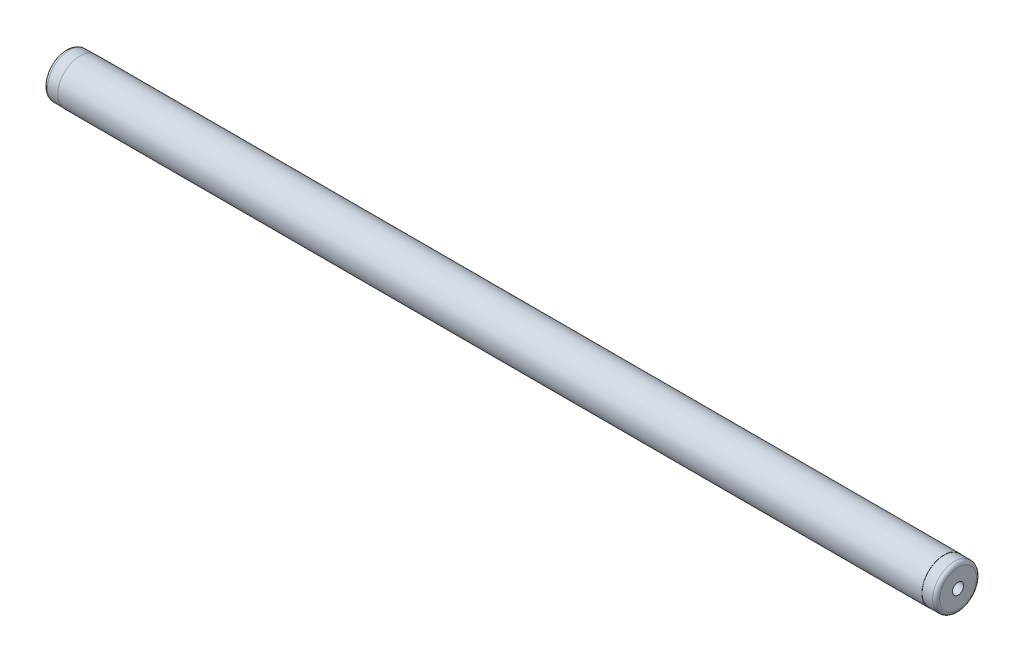
ISO-10303-21;
HEADER;
FILE_DESCRIPTION(('STEP AP214'),'2;1');
FILE_NAME('part.step','',(''),(''),'','','');
FILE_SCHEMA(('AUTOMOTIVE_DESIGN { 1 0 10303 214 1 1 1 1 }'));
ENDSEC;
DATA;
#1=APPLICATION_CONTEXT('core data for automotive mechanical design processes');
#2=APPLICATION_PROTOCOL_DEFINITION('international standard','automotive_design',2000,#1);
#3=PRODUCT_CONTEXT('',#1,'mechanical');
#4=PRODUCT('Part','Part','',(#3));
#5=PRODUCT_RELATED_PRODUCT_CATEGORY('part','',(#4));
#6=PRODUCT_DEFINITION_FORMATION('','',#4);
#7=PRODUCT_DEFINITION_CONTEXT('part definition',#1,'design');
#8=PRODUCT_DEFINITION('design','',#6,#7);
#9=PRODUCT_DEFINITION_SHAPE('','',#8);
#10=(LENGTH_UNIT() NAMED_UNIT(*) SI_UNIT(.MILLI.,.METRE.));
#11=(NAMED_UNIT(*) PLANE_ANGLE_UNIT() SI_UNIT($,.RADIAN.));
#12=(NAMED_UNIT(*) SI_UNIT($,.STERADIAN.) SOLID_ANGLE_UNIT());
#13=UNCERTAINTY_MEASURE_WITH_UNIT(LENGTH_MEASURE(1.E-05),#10,'distance_accuracy_value','');
#14=(GEOMETRIC_REPRESENTATION_CONTEXT(3) GLOBAL_UNCERTAINTY_ASSIGNED_CONTEXT((#13)) GLOBAL_UNIT_ASSIGNED_CONTEXT((#10,
#11,#12)) REPRESENTATION_CONTEXT('',''));
#15=CARTESIAN_POINT('',(0.,0.,0.));
#16=DIRECTION('',(0.,0.,1.));
#17=DIRECTION('',(1.,0.,0.));
#18=AXIS2_PLACEMENT_3D('',#15,#16,#17);
#19=CARTESIAN_POINT('',(60.5,0.4,0.));
#20=DIRECTION('',(1.,0.,0.));
#21=DIRECTION('',(0.,0.,-1.));
#22=AXIS2_PLACEMENT_3D('',#19,#20,#21);
#23=PLANE('',#22);
#24=CARTESIAN_POINT('',(60.5,0.,0.));
#25=DIRECTION('',(1.,0.,0.));
#26=DIRECTION('',(0.,0.,-1.));
#27=AXIS2_PLACEMENT_3D('',#24,#25,#26);
#28=CIRCLE('',#27,0.8);
#29=CARTESIAN_POINT('',(60.5,0.,-0.8));
#30=VERTEX_POINT('',#29);
#31=EDGE_CURVE('E17',#30,#30,#28,.T.);
#32=ORIENTED_EDGE('',*,*,#31,.T.);
#33=EDGE_LOOP('',(#32));
#34=FACE_BOUND('',#33,.T.);
#35=ADVANCED_FACE('F14',(#34),#23,.T.);
#36=CARTESIAN_POINT('',(-60.5,0.4,0.));
#37=DIRECTION('',(-1.,0.,0.));
#38=DIRECTION('',(0.,0.,1.));
#39=AXIS2_PLACEMENT_3D('',#36,#37,#38);
#40=PLANE('',#39);
#41=CARTESIAN_POINT('',(-60.5,0.,0.));
#42=DIRECTION('',(1.,0.,0.));
#43=DIRECTION('',(0.,0.,-1.));
#44=AXIS2_PLACEMENT_3D('',#41,#42,#43);
#45=CIRCLE('',#44,0.8);
#46=CARTESIAN_POINT('',(-60.5,0.,-0.8));
#47=VERTEX_POINT('',#46);
#48=EDGE_CURVE('E46',#47,#47,#45,.F.);
#49=ORIENTED_EDGE('',*,*,#48,.T.);
#50=EDGE_LOOP('',(#49));
#51=FACE_BOUND('',#50,.T.);
#52=ADVANCED_FACE('F57',(#51),#40,.T.);
#53=CARTESIAN_POINT('',(62.,0.,0.));
#54=DIRECTION('',(1.,0.,0.));
#55=DIRECTION('',(0.,0.,-1.));
#56=AXIS2_PLACEMENT_3D('',#53,#54,#55);
#57=CYLINDRICAL_SURFACE('',#56,0.8);
#58=CARTESIAN_POINT('',(63.5,0.,0.));
#59=DIRECTION('',(1.,0.,0.));
#60=DIRECTION('',(0.,0.,-1.));
#61=AXIS2_PLACEMENT_3D('',#58,#59,#60);
#62=CIRCLE('',#61,0.8);
#63=CARTESIAN_POINT('',(63.5,0.,-0.8));
#64=VERTEX_POINT('',#63);
#65=EDGE_CURVE('E44',#64,#64,#62,.F.);
#66=ORIENTED_EDGE('',*,*,#65,.F.);
#67=EDGE_LOOP('',(#66));
#68=FACE_BOUND('',#67,.T.);
#69=ORIENTED_EDGE('',*,*,#31,.F.);
#70=EDGE_LOOP('',(#69));
#71=FACE_BOUND('',#70,.T.);
#72=ADVANCED_FACE('F54',(#68,#71),#57,.F.);
#73=CARTESIAN_POINT('',(-62.,0.,0.));
#74=DIRECTION('',(1.,0.,0.));
#75=DIRECTION('',(0.,0.,-1.));
#76=AXIS2_PLACEMENT_3D('',#73,#74,#75);
#77=CYLINDRICAL_SURFACE('',#76,0.8);
#78=ORIENTED_EDGE('',*,*,#48,.F.);
#79=EDGE_LOOP('',(#78));
#80=FACE_BOUND('',#79,.T.);
#81=CARTESIAN_POINT('',(-63.5,0.,0.));
#82=DIRECTION('',(1.,0.,0.));
#83=DIRECTION('',(0.,0.,-1.));
#84=AXIS2_PLACEMENT_3D('',#81,#82,#83);
#85=CIRCLE('',#84,0.8);
#86=CARTESIAN_POINT('',(-63.5,0.,-0.8));
#87=VERTEX_POINT('',#86);
#88=EDGE_CURVE('E40',#87,#87,#85,.T.);
#89=ORIENTED_EDGE('',*,*,#88,.F.);
#90=EDGE_LOOP('',(#89));
#91=FACE_BOUND('',#90,.T.);
#92=ADVANCED_FACE('F56',(#80,#91),#77,.F.);
#93=CARTESIAN_POINT('',(63.5,1.7125,0.));
#94=DIRECTION('',(1.,0.,0.));
#95=DIRECTION('',(0.,0.,-1.));
#96=AXIS2_PLACEMENT_3D('',#93,#94,#95);
#97=PLANE('',#96);
#98=ORIENTED_EDGE('',*,*,#65,.T.);
#99=EDGE_LOOP('',(#98));
#100=FACE_BOUND('',#99,.T.);
#101=CARTESIAN_POINT('',(63.5,0.,0.));
#102=DIRECTION('',(-1.,0.,0.));
#103=DIRECTION('',(0.,1.,0.));
#104=AXIS2_PLACEMENT_3D('',#101,#102,#103);
#105=CIRCLE('',#104,2.625);
#106=CARTESIAN_POINT('',(63.5,2.625,0.));
#107=VERTEX_POINT('',#106);
#108=EDGE_CURVE('E43',#107,#107,#105,.T.);
#109=ORIENTED_EDGE('',*,*,#108,.F.);
#110=EDGE_LOOP('',(#109));
#111=FACE_BOUND('',#110,.T.);
#112=ADVANCED_FACE('F65',(#100,#111),#97,.T.);
#113=CARTESIAN_POINT('',(-63.5,1.7125,0.));
#114=DIRECTION('',(-1.,0.,0.));
#115=DIRECTION('',(0.,0.,1.));
#116=AXIS2_PLACEMENT_3D('',#113,#114,#115);
#117=PLANE('',#116);
#118=ORIENTED_EDGE('',*,*,#88,.T.);
#119=EDGE_LOOP('',(#118));
#120=FACE_BOUND('',#119,.T.);
#121=CARTESIAN_POINT('',(-63.5,0.,0.));
#122=DIRECTION('',(1.,0.,0.));
#123=DIRECTION('',(0.,1.,0.));
#124=AXIS2_PLACEMENT_3D('',#121,#122,#123);
#125=CIRCLE('',#124,2.625);
#126=CARTESIAN_POINT('',(-63.5,2.625,0.));
#127=VERTEX_POINT('',#126);
#128=EDGE_CURVE('E114',#127,#127,#125,.T.);
#129=ORIENTED_EDGE('',*,*,#128,.F.);
#130=EDGE_LOOP('',(#129));
#131=FACE_BOUND('',#130,.T.);
#132=ADVANCED_FACE('F118',(#120,#131),#117,.T.);
#133=CARTESIAN_POINT('',(63.,0.,0.));
#134=DIRECTION('',(1.,0.,0.));
#135=DIRECTION('',(0.,0.,-1.));
#136=AXIS2_PLACEMENT_3D('',#133,#134,#135);
#137=TOROIDAL_SURFACE('',#136,2.625,0.5);
#138=CARTESIAN_POINT('',(63.,0.,0.));
#139=DIRECTION('',(1.,0.,0.));
#140=DIRECTION('',(0.,0.,-1.));
#141=AXIS2_PLACEMENT_3D('',#138,#139,#140);
#142=CIRCLE('',#141,3.125);
#143=CARTESIAN_POINT('',(63.,0.,-3.125));
#144=VERTEX_POINT('',#143);
#145=EDGE_CURVE('E144',#144,#144,#142,.F.);
#146=ORIENTED_EDGE('',*,*,#145,.F.);
#147=EDGE_LOOP('',(#146));
#148=FACE_BOUND('',#147,.T.);
#149=ORIENTED_EDGE('',*,*,#108,.T.);
#150=EDGE_LOOP('',(#149));
#151=FACE_BOUND('',#150,.T.);
#152=ADVANCED_FACE('F98',(#148,#151),#137,.T.);
#153=CARTESIAN_POINT('',(-63.,0.,0.));
#154=DIRECTION('',(1.,0.,0.));
#155=DIRECTION('',(0.,0.,-1.));
#156=AXIS2_PLACEMENT_3D('',#153,#154,#155);
#157=TOROIDAL_SURFACE('',#156,2.625,0.5);
#158=ORIENTED_EDGE('',*,*,#128,.T.);
#159=EDGE_LOOP('',(#158));
#160=FACE_BOUND('',#159,.T.);
#161=CARTESIAN_POINT('',(-63.,0.,0.));
#162=DIRECTION('',(1.,0.,0.));
#163=DIRECTION('',(0.,0.,-1.));
#164=AXIS2_PLACEMENT_3D('',#161,#162,#163);
#165=CIRCLE('',#164,3.125);
#166=CARTESIAN_POINT('',(-63.,0.,-3.125));
#167=VERTEX_POINT('',#166);
#168=EDGE_CURVE('E39',#167,#167,#165,.T.);
#169=ORIENTED_EDGE('',*,*,#168,.F.);
#170=EDGE_LOOP('',(#169));
#171=FACE_BOUND('',#170,.T.);
#172=ADVANCED_FACE('F93',(#160,#171),#157,.T.);
#173=CARTESIAN_POINT('',(62.25,0.,0.));
#174=DIRECTION('',(1.,0.,0.));
#175=DIRECTION('',(0.,0.,-1.));
#176=AXIS2_PLACEMENT_3D('',#173,#174,#175);
#177=CYLINDRICAL_SURFACE('',#176,3.125);
#178=CARTESIAN_POINT('',(61.5,0.,0.));
#179=DIRECTION('',(1.,0.,0.));
#180=DIRECTION('',(0.,0.,-1.));
#181=AXIS2_PLACEMENT_3D('',#178,#179,#180);
#182=CIRCLE('',#181,3.125);
#183=CARTESIAN_POINT('',(61.5,0.,-3.125));
#184=VERTEX_POINT('',#183);
#185=EDGE_CURVE('E36',#184,#184,#182,.F.);
#186=ORIENTED_EDGE('',*,*,#185,.F.);
#187=EDGE_LOOP('',(#186));
#188=FACE_BOUND('',#187,.T.);
#189=ORIENTED_EDGE('',*,*,#145,.T.);
#190=EDGE_LOOP('',(#189));
#191=FACE_BOUND('',#190,.T.);
#192=ADVANCED_FACE('F90',(#188,#191),#177,.T.);
#193=CARTESIAN_POINT('',(-62.25,0.,0.));
#194=DIRECTION('',(1.,0.,0.));
#195=DIRECTION('',(0.,0.,-1.));
#196=AXIS2_PLACEMENT_3D('',#193,#194,#195);
#197=CYLINDRICAL_SURFACE('',#196,3.125);
#198=ORIENTED_EDGE('',*,*,#168,.T.);
#199=EDGE_LOOP('',(#198));
#200=FACE_BOUND('',#199,.T.);
#201=CARTESIAN_POINT('',(-61.5,0.,0.));
#202=DIRECTION('',(1.,0.,0.));
#203=DIRECTION('',(0.,0.,-1.));
#204=AXIS2_PLACEMENT_3D('',#201,#202,#203);
#205=CIRCLE('',#204,3.125);
#206=CARTESIAN_POINT('',(-61.5,0.,-3.125));
#207=VERTEX_POINT('',#206);
#208=EDGE_CURVE('E26',#207,#207,#205,.T.);
#209=ORIENTED_EDGE('',*,*,#208,.F.);
#210=EDGE_LOOP('',(#209));
#211=FACE_BOUND('',#210,.T.);
#212=ADVANCED_FACE('F86',(#200,#211),#197,.T.);
#213=CARTESIAN_POINT('',(61.5,3.14,0.));
#214=DIRECTION('',(1.,0.,0.));
#215=DIRECTION('',(0.,0.,-1.));
#216=AXIS2_PLACEMENT_3D('',#213,#214,#215);
#217=PLANE('',#216);
#218=ORIENTED_EDGE('',*,*,#185,.T.);
#219=EDGE_LOOP('',(#218));
#220=FACE_BOUND('',#219,.T.);
#221=CARTESIAN_POINT('',(61.5,0.,0.));
#222=DIRECTION('',(1.,0.,0.));
#223=DIRECTION('',(0.,0.,-1.));
#224=AXIS2_PLACEMENT_3D('',#221,#222,#223);
#225=CIRCLE('',#224,3.155);
#226=CARTESIAN_POINT('',(61.5,0.,-3.155));
#227=VERTEX_POINT('',#226);
#228=EDGE_CURVE('E21',#227,#227,#225,.F.);
#229=ORIENTED_EDGE('',*,*,#228,.F.);
#230=EDGE_LOOP('',(#229));
#231=FACE_BOUND('',#230,.T.);
#232=ADVANCED_FACE('F79',(#220,#231),#217,.T.);
#233=CARTESIAN_POINT('',(-61.5,3.14,0.));
#234=DIRECTION('',(-1.,0.,0.));
#235=DIRECTION('',(0.,0.,1.));
#236=AXIS2_PLACEMENT_3D('',#233,#234,#235);
#237=PLANE('',#236);
#238=ORIENTED_EDGE('',*,*,#208,.T.);
#239=EDGE_LOOP('',(#238));
#240=FACE_BOUND('',#239,.T.);
#241=CARTESIAN_POINT('',(-61.5,0.,0.));
#242=DIRECTION('',(1.,0.,0.));
#243=DIRECTION('',(0.,0.,-1.));
#244=AXIS2_PLACEMENT_3D('',#241,#242,#243);
#245=CIRCLE('',#244,3.155);
#246=CARTESIAN_POINT('',(-61.5,0.,-3.155));
#247=VERTEX_POINT('',#246);
#248=EDGE_CURVE('E10',#247,#247,#245,.T.);
#249=ORIENTED_EDGE('',*,*,#248,.F.);
#250=EDGE_LOOP('',(#249));
#251=FACE_BOUND('',#250,.T.);
#252=ADVANCED_FACE('F71',(#240,#251),#237,.T.);
#253=CARTESIAN_POINT('',(0.,0.,0.));
#254=DIRECTION('',(1.,0.,0.));
#255=DIRECTION('',(0.,0.,-1.));
#256=AXIS2_PLACEMENT_3D('',#253,#254,#255);
#257=CYLINDRICAL_SURFACE('',#256,3.155);
#258=ORIENTED_EDGE('',*,*,#248,.T.);
#259=EDGE_LOOP('',(#258));
#260=FACE_BOUND('',#259,.T.);
#261=ORIENTED_EDGE('',*,*,#228,.T.);
#262=EDGE_LOOP('',(#261));
#263=FACE_BOUND('',#262,.T.);
#264=ADVANCED_FACE('F69',(#260,#263),#257,.T.);
#265=CLOSED_SHELL('',(#35,#52,#72,#92,#112,#132,#152,#172,#192,#212,#232,#252,#264));
#266=MANIFOLD_SOLID_BREP('B1',#265);
#267=ADVANCED_BREP_SHAPE_REPRESENTATION('',(#18,#266),#14);
#268=SHAPE_DEFINITION_REPRESENTATION(#9,#267);
ENDSEC;
END-ISO-10303-21;
